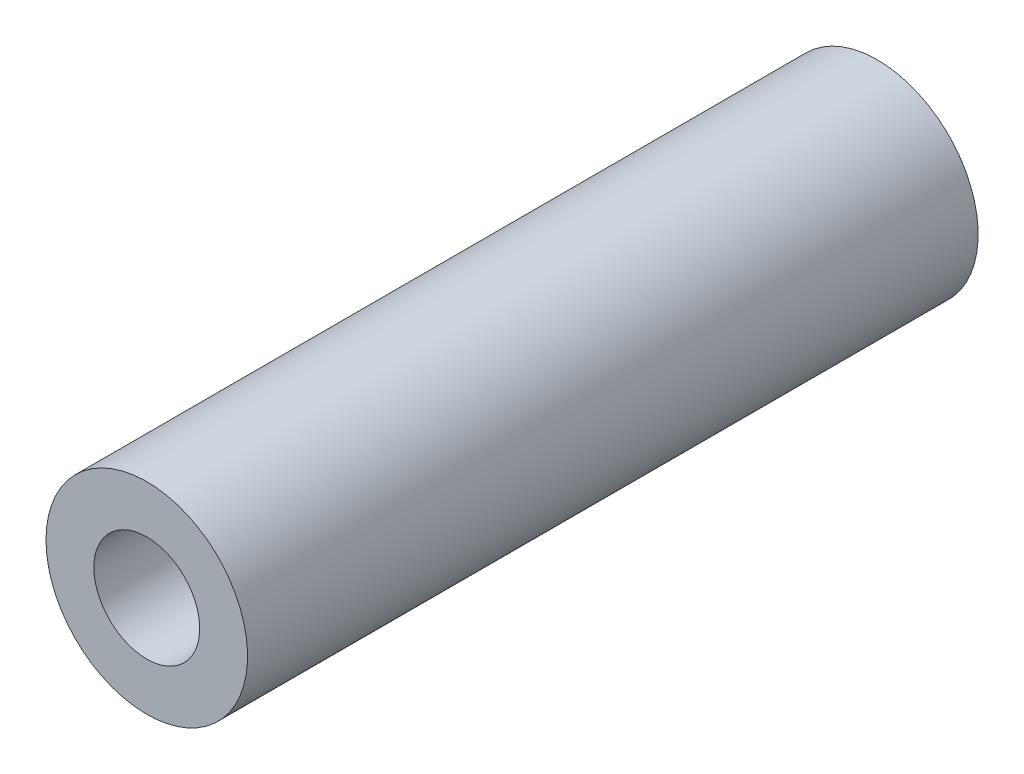
ISO-10303-21;
HEADER;
FILE_DESCRIPTION(('STEP AP214'),'2;1');
FILE_NAME('part.step','',(''),(''),'','','');
FILE_SCHEMA(('AUTOMOTIVE_DESIGN { 1 0 10303 214 1 1 1 1 }'));
ENDSEC;
DATA;
#1=APPLICATION_CONTEXT('core data for automotive mechanical design processes');
#2=APPLICATION_PROTOCOL_DEFINITION('international standard','automotive_design',2000,#1);
#3=PRODUCT_CONTEXT('',#1,'mechanical');
#4=PRODUCT('Part','Part','',(#3));
#5=PRODUCT_RELATED_PRODUCT_CATEGORY('part','',(#4));
#6=PRODUCT_DEFINITION_FORMATION('','',#4);
#7=PRODUCT_DEFINITION_CONTEXT('part definition',#1,'design');
#8=PRODUCT_DEFINITION('design','',#6,#7);
#9=PRODUCT_DEFINITION_SHAPE('','',#8);
#10=(LENGTH_UNIT() NAMED_UNIT(*) SI_UNIT(.MILLI.,.METRE.));
#11=(NAMED_UNIT(*) PLANE_ANGLE_UNIT() SI_UNIT($,.RADIAN.));
#12=(NAMED_UNIT(*) SI_UNIT($,.STERADIAN.) SOLID_ANGLE_UNIT());
#13=UNCERTAINTY_MEASURE_WITH_UNIT(LENGTH_MEASURE(1.E-05),#10,'distance_accuracy_value','');
#14=(GEOMETRIC_REPRESENTATION_CONTEXT(3) GLOBAL_UNCERTAINTY_ASSIGNED_CONTEXT((#13)) GLOBAL_UNIT_ASSIGNED_CONTEXT((#10,
#11,#12)) REPRESENTATION_CONTEXT('',''));
#15=CARTESIAN_POINT('',(0.,0.,0.));
#16=DIRECTION('',(0.,0.,1.));
#17=DIRECTION('',(1.,0.,0.));
#18=AXIS2_PLACEMENT_3D('',#15,#16,#17);
#19=CARTESIAN_POINT('',(0.,0.,29.));
#20=DIRECTION('',(0.,0.,1.));
#21=DIRECTION('',(1.,0.,0.));
#22=AXIS2_PLACEMENT_3D('',#19,#20,#21);
#23=PLANE('',#22);
#24=CARTESIAN_POINT('',(0.,0.,29.));
#25=DIRECTION('',(0.,0.,1.));
#26=DIRECTION('',(1.,0.,0.));
#27=AXIS2_PLACEMENT_3D('',#24,#25,#26);
#28=CIRCLE('',#27,4.);
#29=CARTESIAN_POINT('',(-4.,0.,29.));
#30=VERTEX_POINT('',#29);
#31=EDGE_CURVE('E10',#30,#30,#28,.T.);
#32=ORIENTED_EDGE('',*,*,#31,.T.);
#33=EDGE_LOOP('',(#32));
#34=FACE_BOUND('',#33,.T.);
#35=CARTESIAN_POINT('',(0.,0.,29.));
#36=DIRECTION('',(0.,0.,1.));
#37=DIRECTION('',(1.,0.,0.));
#38=AXIS2_PLACEMENT_3D('',#35,#36,#37);
#39=CIRCLE('',#38,2.1);
#40=CARTESIAN_POINT('',(-2.1,0.,29.));
#41=VERTEX_POINT('',#40);
#42=EDGE_CURVE('E42',#41,#41,#39,.T.);
#43=ORIENTED_EDGE('',*,*,#42,.F.);
#44=EDGE_LOOP('',(#43));
#45=FACE_BOUND('',#44,.T.);
#46=ADVANCED_FACE('F31',(#34,#45),#23,.T.);
#47=CARTESIAN_POINT('',(0.,0.,0.));
#48=DIRECTION('',(0.,0.,1.));
#49=DIRECTION('',(1.,0.,0.));
#50=AXIS2_PLACEMENT_3D('',#47,#48,#49);
#51=PLANE('',#50);
#52=CARTESIAN_POINT('',(0.,0.,0.));
#53=DIRECTION('',(0.,0.,1.));
#54=DIRECTION('',(1.,0.,0.));
#55=AXIS2_PLACEMENT_3D('',#52,#53,#54);
#56=CIRCLE('',#55,4.);
#57=CARTESIAN_POINT('',(-4.,0.,0.));
#58=VERTEX_POINT('',#57);
#59=EDGE_CURVE('E35',#58,#58,#56,.T.);
#60=ORIENTED_EDGE('',*,*,#59,.F.);
#61=EDGE_LOOP('',(#60));
#62=FACE_BOUND('',#61,.T.);
#63=CARTESIAN_POINT('',(0.,0.,0.));
#64=DIRECTION('',(0.,0.,1.));
#65=DIRECTION('',(1.,0.,0.));
#66=AXIS2_PLACEMENT_3D('',#63,#64,#65);
#67=CIRCLE('',#66,2.1);
#68=CARTESIAN_POINT('',(-2.1,0.,0.));
#69=VERTEX_POINT('',#68);
#70=EDGE_CURVE('E44',#69,#69,#67,.T.);
#71=ORIENTED_EDGE('',*,*,#70,.T.);
#72=EDGE_LOOP('',(#71));
#73=FACE_BOUND('',#72,.T.);
#74=ADVANCED_FACE('F54',(#62,#73),#51,.F.);
#75=CARTESIAN_POINT('',(0.,0.,29.));
#76=DIRECTION('',(0.,0.,-1.));
#77=DIRECTION('',(-1.,0.,0.));
#78=AXIS2_PLACEMENT_3D('',#75,#76,#77);
#79=CYLINDRICAL_SURFACE('',#78,4.);
#80=CARTESIAN_POINT('',(-4.,0.,29.));
#81=CARTESIAN_POINT('',(-4.,0.,28.6979166666667));
#82=CARTESIAN_POINT('',(-4.,0.,28.3958333333333));
#83=CARTESIAN_POINT('',(-4.,0.,27.7916666666667));
#84=CARTESIAN_POINT('',(-4.,0.,27.4895833333333));
#85=CARTESIAN_POINT('',(-4.,0.,26.8854166666667));
#86=CARTESIAN_POINT('',(-4.,0.,26.5833333333333));
#87=CARTESIAN_POINT('',(-4.,0.,25.9791666666667));
#88=CARTESIAN_POINT('',(-4.,0.,25.6770833333333));
#89=CARTESIAN_POINT('',(-4.,0.,25.0729166666667));
#90=CARTESIAN_POINT('',(-4.,0.,24.7708333333333));
#91=CARTESIAN_POINT('',(-4.,0.,24.1666666666667));
#92=CARTESIAN_POINT('',(-4.,0.,23.8645833333333));
#93=CARTESIAN_POINT('',(-4.,0.,23.2604166666667));
#94=CARTESIAN_POINT('',(-4.,0.,22.9583333333333));
#95=CARTESIAN_POINT('',(-4.,0.,22.3541666666667));
#96=CARTESIAN_POINT('',(-4.,0.,22.0520833333333));
#97=CARTESIAN_POINT('',(-4.,0.,21.4479166666667));
#98=CARTESIAN_POINT('',(-4.,0.,21.1458333333333));
#99=CARTESIAN_POINT('',(-4.,0.,20.5416666666667));
#100=CARTESIAN_POINT('',(-4.,0.,20.2395833333333));
#101=CARTESIAN_POINT('',(-4.,0.,19.6354166666667));
#102=CARTESIAN_POINT('',(-4.,0.,19.3333333333333));
#103=CARTESIAN_POINT('',(-4.,0.,18.7291666666667));
#104=CARTESIAN_POINT('',(-4.,0.,18.4270833333333));
#105=CARTESIAN_POINT('',(-4.,0.,17.8229166666667));
#106=CARTESIAN_POINT('',(-4.,0.,17.5208333333333));
#107=CARTESIAN_POINT('',(-4.,0.,16.9166666666667));
#108=CARTESIAN_POINT('',(-4.,0.,16.6145833333333));
#109=CARTESIAN_POINT('',(-4.,0.,16.0104166666667));
#110=CARTESIAN_POINT('',(-4.,0.,15.7083333333333));
#111=CARTESIAN_POINT('',(-4.,0.,15.1041666666667));
#112=CARTESIAN_POINT('',(-4.,0.,14.8020833333333));
#113=CARTESIAN_POINT('',(-4.,0.,14.1979166666667));
#114=CARTESIAN_POINT('',(-4.,0.,13.8958333333333));
#115=CARTESIAN_POINT('',(-4.,0.,13.2916666666667));
#116=CARTESIAN_POINT('',(-4.,0.,12.9895833333333));
#117=CARTESIAN_POINT('',(-4.,0.,12.3854166666667));
#118=CARTESIAN_POINT('',(-4.,0.,12.0833333333333));
#119=CARTESIAN_POINT('',(-4.,0.,11.4791666666667));
#120=CARTESIAN_POINT('',(-4.,0.,11.1770833333333));
#121=CARTESIAN_POINT('',(-4.,0.,10.5729166666667));
#122=CARTESIAN_POINT('',(-4.,0.,10.2708333333333));
#123=CARTESIAN_POINT('',(-4.,0.,9.66666666666667));
#124=CARTESIAN_POINT('',(-4.,0.,9.36458333333333));
#125=CARTESIAN_POINT('',(-4.,0.,8.76041666666667));
#126=CARTESIAN_POINT('',(-4.,0.,8.45833333333333));
#127=CARTESIAN_POINT('',(-4.,0.,7.85416666666667));
#128=CARTESIAN_POINT('',(-4.,0.,7.55208333333333));
#129=CARTESIAN_POINT('',(-4.,0.,6.94791666666667));
#130=CARTESIAN_POINT('',(-4.,0.,6.64583333333333));
#131=CARTESIAN_POINT('',(-4.,0.,6.04166666666667));
#132=CARTESIAN_POINT('',(-4.,0.,5.73958333333333));
#133=CARTESIAN_POINT('',(-4.,0.,5.13541666666667));
#134=CARTESIAN_POINT('',(-4.,0.,4.83333333333333));
#135=CARTESIAN_POINT('',(-4.,0.,4.22916666666667));
#136=CARTESIAN_POINT('',(-4.,0.,3.92708333333333));
#137=CARTESIAN_POINT('',(-4.,0.,3.32291666666667));
#138=CARTESIAN_POINT('',(-4.,0.,3.02083333333333));
#139=CARTESIAN_POINT('',(-4.,0.,2.41666666666667));
#140=CARTESIAN_POINT('',(-4.,0.,2.11458333333333));
#141=CARTESIAN_POINT('',(-4.,0.,1.51041666666667));
#142=CARTESIAN_POINT('',(-4.,0.,1.20833333333333));
#143=CARTESIAN_POINT('',(-4.,0.,0.604166666666667));
#144=CARTESIAN_POINT('',(-4.,0.,0.302083333333333));
#145=CARTESIAN_POINT('',(-4.,0.,0.));
#146=B_SPLINE_CURVE_WITH_KNOTS('',3,(#80,#81,#82,#83,#84,#85,#86,#87,#88,#89,#90,#91,#92,#93,
#94,#95,#96,#97,#98,#99,#100,#101,#102,#103,#104,#105,#106,#107,#108,#109,#110,#111,#112,#113,
#114,#115,#116,#117,#118,#119,#120,#121,#122,#123,#124,#125,#126,#127,#128,#129,#130,#131,#132,
#133,#134,#135,#136,#137,#138,#139,#140,#141,#142,#143,#144,#145),.UNSPECIFIED.,.F.,.F.,(4,2,2,
2,2,2,2,2,2,2,2,2,2,2,2,2,2,2,2,2,2,2,2,2,2,2,2,2,2,2,2,2,4),(0.,0.906249999999997,1.8125,
2.71875,3.625,4.53125,5.4375,6.34375,7.25,8.15625,9.0625,9.96875,10.875,11.78125,12.6875,
13.59375,14.5,15.40625,16.3125,17.21875,18.125,19.03125,19.9375,20.84375,21.75,22.65625,23.5625,
24.46875,25.375,26.28125,27.1875,28.09375,29.),.UNSPECIFIED.);
#147=EDGE_CURVE('BSEAM33',#30,#58,#146,.T.);
#148=ORIENTED_EDGE('',*,*,#31,.F.);
#149=ORIENTED_EDGE('',*,*,#59,.T.);
#150=ORIENTED_EDGE('',*,*,#147,.T.);
#151=ORIENTED_EDGE('',*,*,#147,.F.);
#152=EDGE_LOOP('',(#148,#150,#149,#151));
#153=FACE_BOUND('',#152,.T.);
#154=ADVANCED_FACE('F33',(#153),#79,.T.);
#155=CARTESIAN_POINT('',(0.,0.,29.));
#156=DIRECTION('',(0.,0.,-1.));
#157=DIRECTION('',(-1.,0.,0.));
#158=AXIS2_PLACEMENT_3D('',#155,#156,#157);
#159=CYLINDRICAL_SURFACE('',#158,2.1);
#160=CARTESIAN_POINT('',(-2.1,0.,29.));
#161=CARTESIAN_POINT('',(-2.1,0.,28.6979166666667));
#162=CARTESIAN_POINT('',(-2.1,0.,28.3958333333333));
#163=CARTESIAN_POINT('',(-2.1,0.,27.7916666666667));
#164=CARTESIAN_POINT('',(-2.1,0.,27.4895833333333));
#165=CARTESIAN_POINT('',(-2.1,0.,26.8854166666667));
#166=CARTESIAN_POINT('',(-2.1,0.,26.5833333333333));
#167=CARTESIAN_POINT('',(-2.1,0.,25.9791666666667));
#168=CARTESIAN_POINT('',(-2.1,0.,25.6770833333333));
#169=CARTESIAN_POINT('',(-2.1,0.,25.0729166666667));
#170=CARTESIAN_POINT('',(-2.1,0.,24.7708333333333));
#171=CARTESIAN_POINT('',(-2.1,0.,24.1666666666667));
#172=CARTESIAN_POINT('',(-2.1,0.,23.8645833333333));
#173=CARTESIAN_POINT('',(-2.1,0.,23.2604166666667));
#174=CARTESIAN_POINT('',(-2.1,0.,22.9583333333333));
#175=CARTESIAN_POINT('',(-2.1,0.,22.3541666666667));
#176=CARTESIAN_POINT('',(-2.1,0.,22.0520833333333));
#177=CARTESIAN_POINT('',(-2.1,0.,21.4479166666667));
#178=CARTESIAN_POINT('',(-2.1,0.,21.1458333333333));
#179=CARTESIAN_POINT('',(-2.1,0.,20.5416666666667));
#180=CARTESIAN_POINT('',(-2.1,0.,20.2395833333333));
#181=CARTESIAN_POINT('',(-2.1,0.,19.6354166666667));
#182=CARTESIAN_POINT('',(-2.1,0.,19.3333333333333));
#183=CARTESIAN_POINT('',(-2.1,0.,18.7291666666667));
#184=CARTESIAN_POINT('',(-2.1,0.,18.4270833333333));
#185=CARTESIAN_POINT('',(-2.1,0.,17.8229166666667));
#186=CARTESIAN_POINT('',(-2.1,0.,17.5208333333333));
#187=CARTESIAN_POINT('',(-2.1,0.,16.9166666666667));
#188=CARTESIAN_POINT('',(-2.1,0.,16.6145833333333));
#189=CARTESIAN_POINT('',(-2.1,0.,16.0104166666667));
#190=CARTESIAN_POINT('',(-2.1,0.,15.7083333333333));
#191=CARTESIAN_POINT('',(-2.1,0.,15.1041666666667));
#192=CARTESIAN_POINT('',(-2.1,0.,14.8020833333333));
#193=CARTESIAN_POINT('',(-2.1,0.,14.1979166666667));
#194=CARTESIAN_POINT('',(-2.1,0.,13.8958333333333));
#195=CARTESIAN_POINT('',(-2.1,0.,13.2916666666667));
#196=CARTESIAN_POINT('',(-2.1,0.,12.9895833333333));
#197=CARTESIAN_POINT('',(-2.1,0.,12.3854166666667));
#198=CARTESIAN_POINT('',(-2.1,0.,12.0833333333333));
#199=CARTESIAN_POINT('',(-2.1,0.,11.4791666666667));
#200=CARTESIAN_POINT('',(-2.1,0.,11.1770833333333));
#201=CARTESIAN_POINT('',(-2.1,0.,10.5729166666667));
#202=CARTESIAN_POINT('',(-2.1,0.,10.2708333333333));
#203=CARTESIAN_POINT('',(-2.1,0.,9.66666666666667));
#204=CARTESIAN_POINT('',(-2.1,0.,9.36458333333333));
#205=CARTESIAN_POINT('',(-2.1,0.,8.76041666666667));
#206=CARTESIAN_POINT('',(-2.1,0.,8.45833333333333));
#207=CARTESIAN_POINT('',(-2.1,0.,7.85416666666667));
#208=CARTESIAN_POINT('',(-2.1,0.,7.55208333333333));
#209=CARTESIAN_POINT('',(-2.1,0.,6.94791666666667));
#210=CARTESIAN_POINT('',(-2.1,0.,6.64583333333333));
#211=CARTESIAN_POINT('',(-2.1,0.,6.04166666666667));
#212=CARTESIAN_POINT('',(-2.1,0.,5.73958333333333));
#213=CARTESIAN_POINT('',(-2.1,0.,5.13541666666667));
#214=CARTESIAN_POINT('',(-2.1,0.,4.83333333333333));
#215=CARTESIAN_POINT('',(-2.1,0.,4.22916666666667));
#216=CARTESIAN_POINT('',(-2.1,0.,3.92708333333333));
#217=CARTESIAN_POINT('',(-2.1,0.,3.32291666666667));
#218=CARTESIAN_POINT('',(-2.1,0.,3.02083333333333));
#219=CARTESIAN_POINT('',(-2.1,0.,2.41666666666667));
#220=CARTESIAN_POINT('',(-2.1,0.,2.11458333333333));
#221=CARTESIAN_POINT('',(-2.1,0.,1.51041666666667));
#222=CARTESIAN_POINT('',(-2.1,0.,1.20833333333333));
#223=CARTESIAN_POINT('',(-2.1,0.,0.604166666666667));
#224=CARTESIAN_POINT('',(-2.1,0.,0.302083333333333));
#225=CARTESIAN_POINT('',(-2.1,0.,0.));
#226=B_SPLINE_CURVE_WITH_KNOTS('',3,(#160,#161,#162,#163,#164,#165,#166,#167,#168,#169,#170,
#171,#172,#173,#174,#175,#176,#177,#178,#179,#180,#181,#182,#183,#184,#185,#186,#187,#188,#189,
#190,#191,#192,#193,#194,#195,#196,#197,#198,#199,#200,#201,#202,#203,#204,#205,#206,#207,#208,
#209,#210,#211,#212,#213,#214,#215,#216,#217,#218,#219,#220,#221,#222,#223,#224,#225),
.UNSPECIFIED.,.F.,.F.,(4,2,2,2,2,2,2,2,2,2,2,2,2,2,2,2,2,2,2,2,2,2,2,2,2,2,2,2,2,2,2,2,4),(0.,
0.906249999999997,1.8125,2.71875,3.625,4.53125,5.4375,6.34375,7.25,8.15625,9.0625,9.96875,
10.875,11.78125,12.6875,13.59375,14.5,15.40625,16.3125,17.21875,18.125,19.03125,19.9375,
20.84375,21.75,22.65625,23.5625,24.46875,25.375,26.28125,27.1875,28.09375,29.),.UNSPECIFIED.);
#227=EDGE_CURVE('BSEAM50',#41,#69,#226,.T.);
#228=ORIENTED_EDGE('',*,*,#42,.T.);
#229=ORIENTED_EDGE('',*,*,#70,.F.);
#230=ORIENTED_EDGE('',*,*,#227,.T.);
#231=ORIENTED_EDGE('',*,*,#227,.F.);
#232=EDGE_LOOP('',(#228,#230,#229,#231));
#233=FACE_BOUND('',#232,.T.);
#234=ADVANCED_FACE('F50',(#233),#159,.F.);
#235=CLOSED_SHELL('',(#46,#74,#154,#234));
#236=MANIFOLD_SOLID_BREP('B2',#235);
#237=ADVANCED_BREP_SHAPE_REPRESENTATION('',(#18,#236),#14);
#238=SHAPE_DEFINITION_REPRESENTATION(#9,#237);
ENDSEC;
END-ISO-10303-21;
